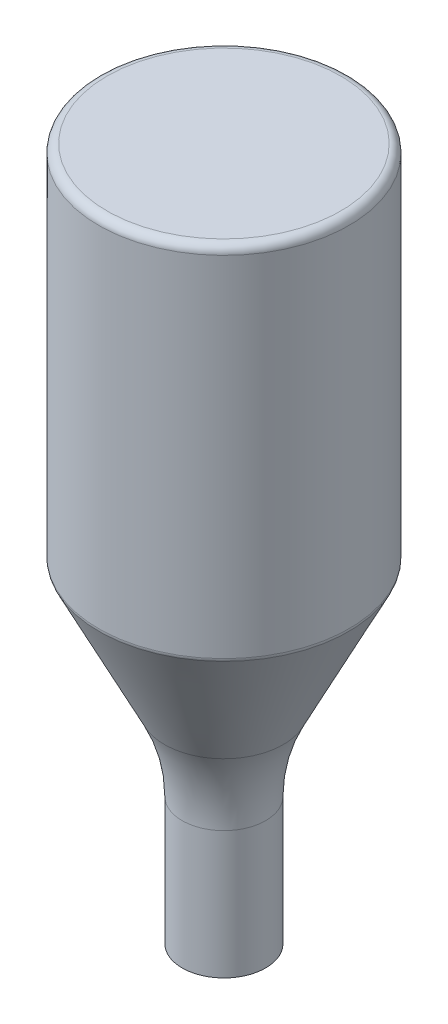
ISO-10303-21;
HEADER;
FILE_DESCRIPTION(('STEP AP214'),'2;1');
FILE_NAME('part.step','',(''),(''),'','','');
FILE_SCHEMA(('AUTOMOTIVE_DESIGN { 1 0 10303 214 1 1 1 1 }'));
ENDSEC;
DATA;
#1=APPLICATION_CONTEXT('core data for automotive mechanical design processes');
#2=APPLICATION_PROTOCOL_DEFINITION('international standard','automotive_design',2000,#1);
#3=PRODUCT_CONTEXT('',#1,'mechanical');
#4=PRODUCT('Part','Part','',(#3));
#5=PRODUCT_RELATED_PRODUCT_CATEGORY('part','',(#4));
#6=PRODUCT_DEFINITION_FORMATION('','',#4);
#7=PRODUCT_DEFINITION_CONTEXT('part definition',#1,'design');
#8=PRODUCT_DEFINITION('design','',#6,#7);
#9=PRODUCT_DEFINITION_SHAPE('','',#8);
#10=(LENGTH_UNIT() NAMED_UNIT(*) SI_UNIT(.MILLI.,.METRE.));
#11=(NAMED_UNIT(*) PLANE_ANGLE_UNIT() SI_UNIT($,.RADIAN.));
#12=(NAMED_UNIT(*) SI_UNIT($,.STERADIAN.) SOLID_ANGLE_UNIT());
#13=UNCERTAINTY_MEASURE_WITH_UNIT(LENGTH_MEASURE(1.E-05),#10,'distance_accuracy_value','');
#14=(GEOMETRIC_REPRESENTATION_CONTEXT(3) GLOBAL_UNCERTAINTY_ASSIGNED_CONTEXT((#13)) GLOBAL_UNIT_ASSIGNED_CONTEXT((#10,
#11,#12)) REPRESENTATION_CONTEXT('',''));
#15=CARTESIAN_POINT('',(0.,0.,0.));
#16=DIRECTION('',(0.,0.,1.));
#17=DIRECTION('',(1.,0.,0.));
#18=AXIS2_PLACEMENT_3D('',#15,#16,#17);
#19=CARTESIAN_POINT('',(0.,0.,0.));
#20=DIRECTION('',(0.,1.,0.));
#21=DIRECTION('',(-1.,0.,0.));
#22=AXIS2_PLACEMENT_3D('',#19,#20,#21);
#23=CYLINDRICAL_SURFACE('',#22,30.);
#24=CARTESIAN_POINT('',(0.,-36.,0.));
#25=DIRECTION('',(0.,1.,0.));
#26=DIRECTION('',(-1.,0.,0.));
#27=AXIS2_PLACEMENT_3D('',#24,#25,#26);
#28=CIRCLE('',#27,30.);
#29=CARTESIAN_POINT('',(-30.,-36.,0.));
#30=VERTEX_POINT('',#29);
#31=EDGE_CURVE('E12',#30,#30,#28,.F.);
#32=ORIENTED_EDGE('',*,*,#31,.T.);
#33=EDGE_LOOP('',(#32));
#34=FACE_BOUND('',#33,.T.);
#35=CARTESIAN_POINT('',(0.,-119.627445757774,0.));
#36=DIRECTION('',(0.,1.,0.));
#37=DIRECTION('',(-1.,0.,0.));
#38=AXIS2_PLACEMENT_3D('',#35,#36,#37);
#39=CIRCLE('',#38,30.);
#40=CARTESIAN_POINT('',(-30.,-119.627445757774,0.));
#41=VERTEX_POINT('',#40);
#42=EDGE_CURVE('E53',#41,#41,#39,.T.);
#43=ORIENTED_EDGE('',*,*,#42,.T.);
#44=EDGE_LOOP('',(#43));
#45=FACE_BOUND('',#44,.T.);
#46=ADVANCED_FACE('F42',(#34,#45),#23,.T.);
#47=CARTESIAN_POINT('',(0.,-119.627445757774,0.));
#48=DIRECTION('',(0.,1.,0.));
#49=DIRECTION('',(-1.,0.,0.));
#50=AXIS2_PLACEMENT_3D('',#47,#48,#49);
#51=TOROIDAL_SURFACE('',#50,28.4218349046266,1.57816509537341);
#52=ORIENTED_EDGE('',*,*,#42,.F.);
#53=EDGE_LOOP('',(#52));
#54=FACE_BOUND('',#53,.T.);
#55=CARTESIAN_POINT('',(0.,-120.333222644369,0.));
#56=DIRECTION('',(0.,1.,0.));
#57=DIRECTION('',(-1.,0.,0.));
#58=AXIS2_PLACEMENT_3D('',#55,#56,#57);
#59=CIRCLE('',#58,29.8333886778155);
#60=CARTESIAN_POINT('',(-29.8333886778155,-120.333222644369,0.));
#61=VERTEX_POINT('',#60);
#62=EDGE_CURVE('E57',#61,#61,#59,.T.);
#63=ORIENTED_EDGE('',*,*,#62,.T.);
#64=EDGE_LOOP('',(#63));
#65=FACE_BOUND('',#64,.T.);
#66=ADVANCED_FACE('F93',(#54,#65),#51,.T.);
#67=CARTESIAN_POINT('',(0.,-151.554175279993,0.));
#68=DIRECTION('',(0.,1.,0.));
#69=DIRECTION('',(-1.,0.,0.));
#70=AXIS2_PLACEMENT_3D('',#67,#68,#69);
#71=CONICAL_SURFACE('',#70,14.2229123600034,0.463647609000806);
#72=ORIENTED_EDGE('',*,*,#62,.F.);
#73=EDGE_LOOP('',(#72));
#74=FACE_BOUND('',#73,.T.);
#75=CARTESIAN_POINT('',(0.,-151.554175279993,0.));
#76=DIRECTION('',(0.,1.,0.));
#77=DIRECTION('',(-1.,0.,0.));
#78=AXIS2_PLACEMENT_3D('',#75,#76,#77);
#79=CIRCLE('',#78,14.2229123600034);
#80=CARTESIAN_POINT('',(-14.2229123600033,-151.554175279993,0.));
#81=VERTEX_POINT('',#80);
#82=EDGE_CURVE('E62',#81,#81,#79,.T.);
#83=ORIENTED_EDGE('',*,*,#82,.T.);
#84=EDGE_LOOP('',(#83));
#85=FACE_BOUND('',#84,.T.);
#86=ADVANCED_FACE('F97',(#74,#85),#71,.T.);
#87=CARTESIAN_POINT('',(0.,-169.442719099992,0.));
#88=DIRECTION('',(0.,1.,0.));
#89=DIRECTION('',(-1.,0.,0.));
#90=AXIS2_PLACEMENT_3D('',#87,#88,#89);
#91=TOROIDAL_SURFACE('',#90,50.,40.);
#92=ORIENTED_EDGE('',*,*,#82,.F.);
#93=EDGE_LOOP('',(#92));
#94=FACE_BOUND('',#93,.T.);
#95=CARTESIAN_POINT('',(0.,-169.442719099992,0.));
#96=DIRECTION('',(0.,1.,0.));
#97=DIRECTION('',(-1.,0.,0.));
#98=AXIS2_PLACEMENT_3D('',#95,#96,#97);
#99=CIRCLE('',#98,10.);
#100=CARTESIAN_POINT('',(-9.99999999999999,-169.442719099992,0.));
#101=VERTEX_POINT('',#100);
#102=EDGE_CURVE('E65',#101,#101,#99,.T.);
#103=ORIENTED_EDGE('',*,*,#102,.T.);
#104=EDGE_LOOP('',(#103));
#105=FACE_BOUND('',#104,.T.);
#106=ADVANCED_FACE('F104',(#94,#105),#91,.F.);
#107=CARTESIAN_POINT('',(0.,0.,0.));
#108=DIRECTION('',(0.,1.,0.));
#109=DIRECTION('',(-1.,0.,0.));
#110=AXIS2_PLACEMENT_3D('',#107,#108,#109);
#111=CYLINDRICAL_SURFACE('',#110,10.);
#112=ORIENTED_EDGE('',*,*,#102,.F.);
#113=EDGE_LOOP('',(#112));
#114=FACE_BOUND('',#113,.T.);
#115=CARTESIAN_POINT('',(0.,-200.,0.));
#116=DIRECTION('',(0.,1.,0.));
#117=DIRECTION('',(-1.,0.,0.));
#118=AXIS2_PLACEMENT_3D('',#115,#116,#117);
#119=CIRCLE('',#118,10.);
#120=CARTESIAN_POINT('',(-9.99999999999998,-200.,0.));
#121=VERTEX_POINT('',#120);
#122=EDGE_CURVE('E68',#121,#121,#119,.T.);
#123=ORIENTED_EDGE('',*,*,#122,.T.);
#124=EDGE_LOOP('',(#123));
#125=FACE_BOUND('',#124,.T.);
#126=ADVANCED_FACE('F108',(#114,#125),#111,.T.);
#127=CARTESIAN_POINT('',(10.,-200.,0.));
#128=DIRECTION('',(0.,1.,0.));
#129=DIRECTION('',(-1.,0.,0.));
#130=AXIS2_PLACEMENT_3D('',#127,#128,#129);
#131=PLANE('',#130);
#132=ORIENTED_EDGE('',*,*,#122,.F.);
#133=EDGE_LOOP('',(#132));
#134=FACE_BOUND('',#133,.T.);
#135=CARTESIAN_POINT('',(0.,-200.,0.));
#136=DIRECTION('',(0.,1.,0.));
#137=DIRECTION('',(-1.,0.,0.));
#138=AXIS2_PLACEMENT_3D('',#135,#136,#137);
#139=CIRCLE('',#138,5.);
#140=CARTESIAN_POINT('',(-4.99999999999997,-200.,0.));
#141=VERTEX_POINT('',#140);
#142=EDGE_CURVE('E71',#141,#141,#139,.T.);
#143=ORIENTED_EDGE('',*,*,#142,.T.);
#144=EDGE_LOOP('',(#143));
#145=FACE_BOUND('',#144,.T.);
#146=ADVANCED_FACE('F89',(#134,#145),#131,.F.);
#147=CARTESIAN_POINT('',(0.,0.,0.));
#148=DIRECTION('',(0.,1.,0.));
#149=DIRECTION('',(-1.,0.,0.));
#150=AXIS2_PLACEMENT_3D('',#147,#148,#149);
#151=CYLINDRICAL_SURFACE('',#150,5.);
#152=ORIENTED_EDGE('',*,*,#142,.F.);
#153=EDGE_LOOP('',(#152));
#154=FACE_BOUND('',#153,.T.);
#155=CARTESIAN_POINT('',(0.,-170.,0.));
#156=DIRECTION('',(0.,1.,0.));
#157=DIRECTION('',(-1.,0.,0.));
#158=AXIS2_PLACEMENT_3D('',#155,#156,#157);
#159=CIRCLE('',#158,5.);
#160=CARTESIAN_POINT('',(-4.99999999999998,-170.,0.));
#161=VERTEX_POINT('',#160);
#162=EDGE_CURVE('E74',#161,#161,#159,.T.);
#163=ORIENTED_EDGE('',*,*,#162,.T.);
#164=EDGE_LOOP('',(#163));
#165=FACE_BOUND('',#164,.T.);
#166=ADVANCED_FACE('F78',(#154,#165),#151,.F.);
#167=CARTESIAN_POINT('',(5.00000000000002,-170.,0.));
#168=DIRECTION('',(0.,1.,0.));
#169=DIRECTION('',(-1.,0.,0.));
#170=AXIS2_PLACEMENT_3D('',#167,#168,#169);
#171=PLANE('',#170);
#172=ORIENTED_EDGE('',*,*,#162,.F.);
#173=EDGE_LOOP('',(#172));
#174=FACE_BOUND('',#173,.T.);
#175=ADVANCED_FACE('F80',(#174),#171,.F.);
#176=CARTESIAN_POINT('',(0.,-34.,0.));
#177=DIRECTION('',(0.,1.,0.));
#178=DIRECTION('',(-1.,0.,0.));
#179=AXIS2_PLACEMENT_3D('',#176,#177,#178);
#180=PLANE('',#179);
#181=CARTESIAN_POINT('',(0.,-34.,0.));
#182=DIRECTION('',(0.,1.,0.));
#183=DIRECTION('',(-1.,0.,0.));
#184=AXIS2_PLACEMENT_3D('',#181,#182,#183);
#185=CIRCLE('',#184,28.);
#186=CARTESIAN_POINT('',(-28.,-34.,0.));
#187=VERTEX_POINT('',#186);
#188=EDGE_CURVE('E49',#187,#187,#185,.T.);
#189=ORIENTED_EDGE('',*,*,#188,.T.);
#190=EDGE_LOOP('',(#189));
#191=FACE_BOUND('',#190,.T.);
#192=ADVANCED_FACE('F82',(#191),#180,.T.);
#193=CARTESIAN_POINT('',(0.,-36.,0.));
#194=DIRECTION('',(0.,1.,0.));
#195=DIRECTION('',(-1.,0.,0.));
#196=AXIS2_PLACEMENT_3D('',#193,#194,#195);
#197=TOROIDAL_SURFACE('',#196,28.,2.);
#198=ORIENTED_EDGE('',*,*,#31,.F.);
#199=EDGE_LOOP('',(#198));
#200=FACE_BOUND('',#199,.T.);
#201=ORIENTED_EDGE('',*,*,#188,.F.);
#202=EDGE_LOOP('',(#201));
#203=FACE_BOUND('',#202,.T.);
#204=ADVANCED_FACE('F44',(#200,#203),#197,.T.);
#205=CLOSED_SHELL('',(#46,#66,#86,#106,#126,#146,#166,#175,#192,#204));
#206=MANIFOLD_SOLID_BREP('B2',#205);
#207=ADVANCED_BREP_SHAPE_REPRESENTATION('',(#18,#206),#14);
#208=SHAPE_DEFINITION_REPRESENTATION(#9,#207);
ENDSEC;
END-ISO-10303-21;
